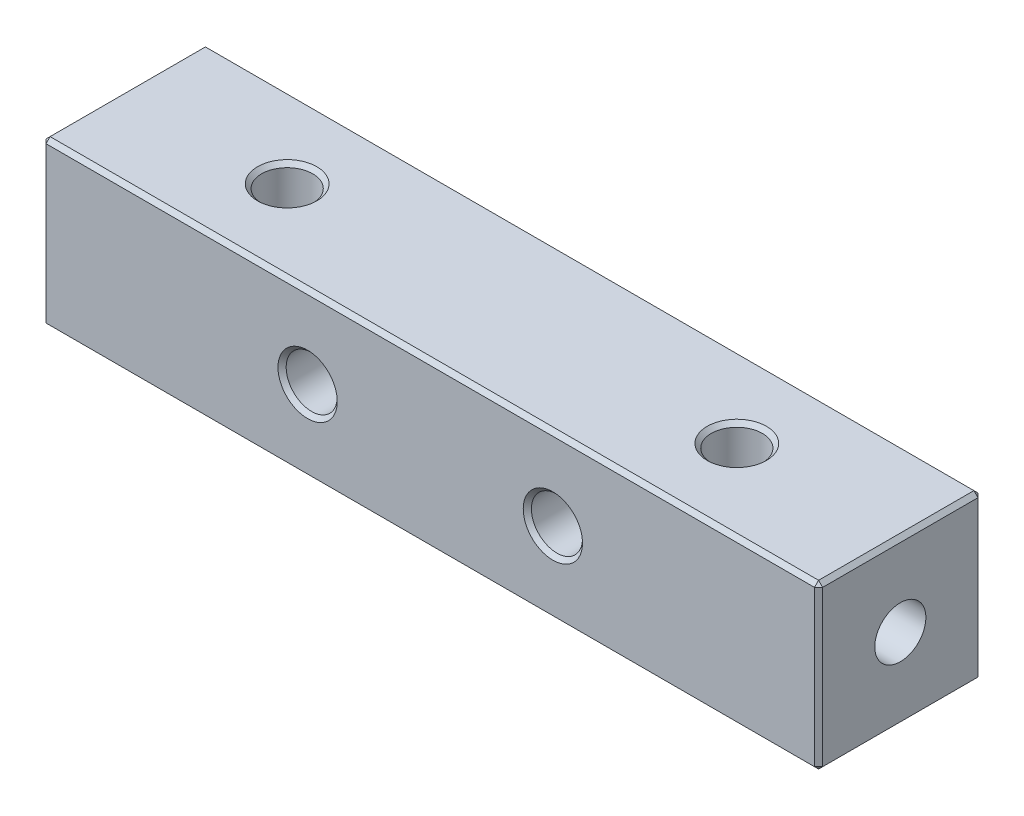
ISO-10303-21;
HEADER;
FILE_DESCRIPTION(('STEP AP214'),'2;1');
FILE_NAME('part.step','',(''),(''),'','','');
FILE_SCHEMA(('AUTOMOTIVE_DESIGN { 1 0 10303 214 1 1 1 1 }'));
ENDSEC;
DATA;
#1=APPLICATION_CONTEXT('core data for automotive mechanical design processes');
#2=APPLICATION_PROTOCOL_DEFINITION('international standard','automotive_design',2000,#1);
#3=PRODUCT_CONTEXT('',#1,'mechanical');
#4=PRODUCT('Part','Part','',(#3));
#5=PRODUCT_RELATED_PRODUCT_CATEGORY('part','',(#4));
#6=PRODUCT_DEFINITION_FORMATION('','',#4);
#7=PRODUCT_DEFINITION_CONTEXT('part definition',#1,'design');
#8=PRODUCT_DEFINITION('design','',#6,#7);
#9=PRODUCT_DEFINITION_SHAPE('','',#8);
#10=(LENGTH_UNIT() NAMED_UNIT(*) SI_UNIT(.MILLI.,.METRE.));
#11=(NAMED_UNIT(*) PLANE_ANGLE_UNIT() SI_UNIT($,.RADIAN.));
#12=(NAMED_UNIT(*) SI_UNIT($,.STERADIAN.) SOLID_ANGLE_UNIT());
#13=UNCERTAINTY_MEASURE_WITH_UNIT(LENGTH_MEASURE(1.E-05),#10,'distance_accuracy_value','');
#14=(GEOMETRIC_REPRESENTATION_CONTEXT(3) GLOBAL_UNCERTAINTY_ASSIGNED_CONTEXT((#13)) GLOBAL_UNIT_ASSIGNED_CONTEXT((#10,
#11,#12)) REPRESENTATION_CONTEXT('',''));
#15=CARTESIAN_POINT('',(0.,0.,0.));
#16=DIRECTION('',(0.,0.,1.));
#17=DIRECTION('',(1.,0.,0.));
#18=AXIS2_PLACEMENT_3D('',#15,#16,#17);
#19=CARTESIAN_POINT('',(19.,4.,-4.));
#20=DIRECTION('',(-1.,0.,0.));
#21=DIRECTION('',(0.,0.,1.));
#22=AXIS2_PLACEMENT_3D('',#19,#20,#21);
#23=PLANE('',#22);
#24=DIRECTION('',(0.,-1.,0.));
#25=VECTOR('',#24,1.);
#26=CARTESIAN_POINT('',(19.,4.,3.8));
#27=LINE('',#26,#25);
#28=CARTESIAN_POINT('',(19.,3.8,3.8));
#29=VERTEX_POINT('',#28);
#30=CARTESIAN_POINT('',(19.,-3.8,3.8));
#31=VERTEX_POINT('',#30);
#32=EDGE_CURVE('E222',#29,#31,#27,.T.);
#33=ORIENTED_EDGE('',*,*,#32,.T.);
#34=DIRECTION('',(0.,0.,-1.));
#35=VECTOR('',#34,1.);
#36=CARTESIAN_POINT('',(19.,-3.8,-4.));
#37=LINE('',#36,#35);
#38=CARTESIAN_POINT('',(19.,-3.8,-3.8));
#39=VERTEX_POINT('',#38);
#40=EDGE_CURVE('E224',#31,#39,#37,.T.);
#41=ORIENTED_EDGE('',*,*,#40,.T.);
#42=DIRECTION('',(0.,1.,0.));
#43=VECTOR('',#42,1.);
#44=CARTESIAN_POINT('',(19.,4.,-3.8));
#45=LINE('',#44,#43);
#46=CARTESIAN_POINT('',(19.,3.8,-3.8));
#47=VERTEX_POINT('',#46);
#48=EDGE_CURVE('E218',#39,#47,#45,.T.);
#49=ORIENTED_EDGE('',*,*,#48,.T.);
#50=DIRECTION('',(0.,0.,1.));
#51=VECTOR('',#50,1.);
#52=CARTESIAN_POINT('',(19.,3.8,4.));
#53=LINE('',#52,#51);
#54=EDGE_CURVE('E220',#47,#29,#53,.T.);
#55=ORIENTED_EDGE('',*,*,#54,.T.);
#56=EDGE_LOOP('',(#33,#41,#49,#55));
#57=FACE_BOUND('',#56,.T.);
#58=CARTESIAN_POINT('',(19.,0.,0.));
#59=DIRECTION('',(1.,0.,0.));
#60=DIRECTION('',(0.,0.,-1.));
#61=AXIS2_PLACEMENT_3D('',#58,#59,#60);
#62=CIRCLE('',#61,1.24999999999999);
#63=CARTESIAN_POINT('',(19.,0.,-1.24999999999999));
#64=VERTEX_POINT('',#63);
#65=EDGE_CURVE('E322',#64,#64,#62,.T.);
#66=ORIENTED_EDGE('',*,*,#65,.F.);
#67=EDGE_LOOP('',(#66));
#68=FACE_BOUND('',#67,.T.);
#69=ADVANCED_FACE('F39',(#57,#68),#23,.F.);
#70=CARTESIAN_POINT('',(-19.,4.,-4.));
#71=DIRECTION('',(1.,0.,0.));
#72=DIRECTION('',(0.,0.,-1.));
#73=AXIS2_PLACEMENT_3D('',#70,#71,#72);
#74=PLANE('',#73);
#75=DIRECTION('',(0.,-1.,0.));
#76=VECTOR('',#75,1.);
#77=CARTESIAN_POINT('',(-19.,4.,-3.8));
#78=LINE('',#77,#76);
#79=CARTESIAN_POINT('',(-19.,3.8,-3.8));
#80=VERTEX_POINT('',#79);
#81=CARTESIAN_POINT('',(-19.,-3.8,-3.8));
#82=VERTEX_POINT('',#81);
#83=EDGE_CURVE('E209',#80,#82,#78,.T.);
#84=ORIENTED_EDGE('',*,*,#83,.T.);
#85=DIRECTION('',(0.,0.,1.));
#86=VECTOR('',#85,1.);
#87=CARTESIAN_POINT('',(-19.,-3.8,-4.));
#88=LINE('',#87,#86);
#89=CARTESIAN_POINT('',(-19.,-3.8,3.8));
#90=VERTEX_POINT('',#89);
#91=EDGE_CURVE('E215',#82,#90,#88,.T.);
#92=ORIENTED_EDGE('',*,*,#91,.T.);
#93=DIRECTION('',(0.,1.,0.));
#94=VECTOR('',#93,1.);
#95=CARTESIAN_POINT('',(-19.,4.,3.8));
#96=LINE('',#95,#94);
#97=CARTESIAN_POINT('',(-19.,3.8,3.8));
#98=VERTEX_POINT('',#97);
#99=EDGE_CURVE('E213',#90,#98,#96,.T.);
#100=ORIENTED_EDGE('',*,*,#99,.T.);
#101=DIRECTION('',(0.,0.,-1.));
#102=VECTOR('',#101,1.);
#103=CARTESIAN_POINT('',(-19.,3.8,-4.));
#104=LINE('',#103,#102);
#105=EDGE_CURVE('E211',#98,#80,#104,.T.);
#106=ORIENTED_EDGE('',*,*,#105,.T.);
#107=EDGE_LOOP('',(#84,#92,#100,#106));
#108=FACE_BOUND('',#107,.T.);
#109=CARTESIAN_POINT('',(-19.,0.,0.));
#110=DIRECTION('',(-1.,0.,0.));
#111=DIRECTION('',(0.,0.,1.));
#112=AXIS2_PLACEMENT_3D('',#109,#110,#111);
#113=CIRCLE('',#112,1.25);
#114=CARTESIAN_POINT('',(-19.,0.,1.25));
#115=VERTEX_POINT('',#114);
#116=EDGE_CURVE('E246',#115,#115,#113,.T.);
#117=ORIENTED_EDGE('',*,*,#116,.F.);
#118=EDGE_LOOP('',(#117));
#119=FACE_BOUND('',#118,.T.);
#120=ADVANCED_FACE('F358',(#108,#119),#74,.F.);
#121=CARTESIAN_POINT('',(-19.,4.,-4.));
#122=DIRECTION('',(0.,0.,1.));
#123=DIRECTION('',(1.,0.,0.));
#124=AXIS2_PLACEMENT_3D('',#121,#122,#123);
#125=PLANE('',#124);
#126=DIRECTION('',(1.,0.,0.));
#127=VECTOR('',#126,1.);
#128=CARTESIAN_POINT('',(19.,3.8,-4.));
#129=LINE('',#128,#127);
#130=CARTESIAN_POINT('',(-18.8,3.8,-4.));
#131=VERTEX_POINT('',#130);
#132=CARTESIAN_POINT('',(18.8,3.8,-4.));
#133=VERTEX_POINT('',#132);
#134=EDGE_CURVE('E237',#131,#133,#129,.T.);
#135=ORIENTED_EDGE('',*,*,#134,.T.);
#136=DIRECTION('',(0.,-1.,0.));
#137=VECTOR('',#136,1.);
#138=CARTESIAN_POINT('',(18.8,4.,-4.));
#139=LINE('',#138,#137);
#140=CARTESIAN_POINT('',(18.8,-3.8,-4.));
#141=VERTEX_POINT('',#140);
#142=EDGE_CURVE('E239',#133,#141,#139,.T.);
#143=ORIENTED_EDGE('',*,*,#142,.T.);
#144=DIRECTION('',(-1.,0.,0.));
#145=VECTOR('',#144,1.);
#146=CARTESIAN_POINT('',(-19.,-3.8,-4.));
#147=LINE('',#146,#145);
#148=CARTESIAN_POINT('',(-18.8,-3.8,-4.));
#149=VERTEX_POINT('',#148);
#150=EDGE_CURVE('E233',#141,#149,#147,.T.);
#151=ORIENTED_EDGE('',*,*,#150,.T.);
#152=DIRECTION('',(0.,1.,0.));
#153=VECTOR('',#152,1.);
#154=CARTESIAN_POINT('',(-18.8,4.,-4.));
#155=LINE('',#154,#153);
#156=EDGE_CURVE('E235',#149,#131,#155,.T.);
#157=ORIENTED_EDGE('',*,*,#156,.T.);
#158=EDGE_LOOP('',(#135,#143,#151,#157));
#159=FACE_BOUND('',#158,.T.);
#160=CARTESIAN_POINT('',(-6.,0.,-4.));
#161=DIRECTION('',(0.,0.,1.));
#162=DIRECTION('',(1.,0.,0.));
#163=AXIS2_PLACEMENT_3D('',#160,#161,#162);
#164=CIRCLE('',#163,1.44999999999999);
#165=CARTESIAN_POINT('',(-4.55000000000001,0.,-4.));
#166=VERTEX_POINT('',#165);
#167=EDGE_CURVE('E230',#166,#166,#164,.T.);
#168=ORIENTED_EDGE('',*,*,#167,.T.);
#169=EDGE_LOOP('',(#168));
#170=FACE_BOUND('',#169,.T.);
#171=CARTESIAN_POINT('',(6.,0.,-4.));
#172=DIRECTION('',(0.,0.,1.));
#173=DIRECTION('',(1.,0.,0.));
#174=AXIS2_PLACEMENT_3D('',#171,#172,#173);
#175=CIRCLE('',#174,1.44999999999998);
#176=CARTESIAN_POINT('',(7.44999999999998,0.,-4.));
#177=VERTEX_POINT('',#176);
#178=EDGE_CURVE('E227',#177,#177,#175,.T.);
#179=ORIENTED_EDGE('',*,*,#178,.T.);
#180=EDGE_LOOP('',(#179));
#181=FACE_BOUND('',#180,.T.);
#182=ADVANCED_FACE('F364',(#159,#170,#181),#125,.F.);
#183=CARTESIAN_POINT('',(-19.,4.,4.));
#184=DIRECTION('',(0.,0.,-1.));
#185=DIRECTION('',(-1.,0.,0.));
#186=AXIS2_PLACEMENT_3D('',#183,#184,#185);
#187=PLANE('',#186);
#188=CARTESIAN_POINT('',(-6.,0.,4.));
#189=DIRECTION('',(0.,0.,-1.));
#190=DIRECTION('',(-1.,0.,0.));
#191=AXIS2_PLACEMENT_3D('',#188,#189,#190);
#192=CIRCLE('',#191,1.45);
#193=CARTESIAN_POINT('',(-7.45,0.,4.));
#194=VERTEX_POINT('',#193);
#195=EDGE_CURVE('E179',#194,#194,#192,.T.);
#196=ORIENTED_EDGE('',*,*,#195,.T.);
#197=EDGE_LOOP('',(#196));
#198=FACE_BOUND('',#197,.T.);
#199=CARTESIAN_POINT('',(6.,0.,4.));
#200=DIRECTION('',(0.,0.,-1.));
#201=DIRECTION('',(-1.,0.,0.));
#202=AXIS2_PLACEMENT_3D('',#199,#200,#201);
#203=CIRCLE('',#202,1.45);
#204=CARTESIAN_POINT('',(4.55,0.,4.));
#205=VERTEX_POINT('',#204);
#206=EDGE_CURVE('E176',#205,#205,#203,.T.);
#207=ORIENTED_EDGE('',*,*,#206,.T.);
#208=EDGE_LOOP('',(#207));
#209=FACE_BOUND('',#208,.T.);
#210=DIRECTION('',(-1.,0.,0.));
#211=VECTOR('',#210,1.);
#212=CARTESIAN_POINT('',(-19.,3.8,4.));
#213=LINE('',#212,#211);
#214=CARTESIAN_POINT('',(18.8,3.8,4.));
#215=VERTEX_POINT('',#214);
#216=CARTESIAN_POINT('',(-18.8,3.8,4.));
#217=VERTEX_POINT('',#216);
#218=EDGE_CURVE('E167',#215,#217,#213,.T.);
#219=ORIENTED_EDGE('',*,*,#218,.T.);
#220=DIRECTION('',(0.,-1.,0.));
#221=VECTOR('',#220,1.);
#222=CARTESIAN_POINT('',(-18.8,4.,4.));
#223=LINE('',#222,#221);
#224=CARTESIAN_POINT('',(-18.8,-3.8,4.));
#225=VERTEX_POINT('',#224);
#226=EDGE_CURVE('E173',#217,#225,#223,.T.);
#227=ORIENTED_EDGE('',*,*,#226,.T.);
#228=DIRECTION('',(1.,0.,0.));
#229=VECTOR('',#228,1.);
#230=CARTESIAN_POINT('',(-19.,-3.8,4.));
#231=LINE('',#230,#229);
#232=CARTESIAN_POINT('',(18.8,-3.8,4.));
#233=VERTEX_POINT('',#232);
#234=EDGE_CURVE('E171',#225,#233,#231,.T.);
#235=ORIENTED_EDGE('',*,*,#234,.T.);
#236=DIRECTION('',(0.,1.,0.));
#237=VECTOR('',#236,1.);
#238=CARTESIAN_POINT('',(18.8,4.,4.));
#239=LINE('',#238,#237);
#240=EDGE_CURVE('E169',#233,#215,#239,.T.);
#241=ORIENTED_EDGE('',*,*,#240,.T.);
#242=EDGE_LOOP('',(#219,#227,#235,#241));
#243=FACE_BOUND('',#242,.T.);
#244=ADVANCED_FACE('F524',(#198,#209,#243),#187,.F.);
#245=CARTESIAN_POINT('',(0.,4.,0.));
#246=DIRECTION('',(0.,1.,0.));
#247=DIRECTION('',(0.,0.,1.));
#248=AXIS2_PLACEMENT_3D('',#245,#246,#247);
#249=PLANE('',#248);
#250=CARTESIAN_POINT('',(11.,4.,0.));
#251=DIRECTION('',(0.,1.,0.));
#252=DIRECTION('',(0.,0.,1.));
#253=AXIS2_PLACEMENT_3D('',#250,#251,#252);
#254=CIRCLE('',#253,1.44999999999999);
#255=CARTESIAN_POINT('',(11.,4.,1.44999999999999));
#256=VERTEX_POINT('',#255);
#257=EDGE_CURVE('E206',#256,#256,#254,.F.);
#258=ORIENTED_EDGE('',*,*,#257,.T.);
#259=EDGE_LOOP('',(#258));
#260=FACE_BOUND('',#259,.T.);
#261=CARTESIAN_POINT('',(-11.,4.,0.));
#262=DIRECTION('',(0.,1.,0.));
#263=DIRECTION('',(0.,0.,1.));
#264=AXIS2_PLACEMENT_3D('',#261,#262,#263);
#265=CIRCLE('',#264,1.44999999999998);
#266=CARTESIAN_POINT('',(-11.,4.,1.44999999999998));
#267=VERTEX_POINT('',#266);
#268=EDGE_CURVE('E203',#267,#267,#265,.F.);
#269=ORIENTED_EDGE('',*,*,#268,.T.);
#270=EDGE_LOOP('',(#269));
#271=FACE_BOUND('',#270,.T.);
#272=DIRECTION('',(0.,0.,1.));
#273=VECTOR('',#272,1.);
#274=CARTESIAN_POINT('',(-18.8,4.,4.));
#275=LINE('',#274,#273);
#276=CARTESIAN_POINT('',(-18.8,4.,-3.8));
#277=VERTEX_POINT('',#276);
#278=CARTESIAN_POINT('',(-18.8,4.,3.8));
#279=VERTEX_POINT('',#278);
#280=EDGE_CURVE('E198',#277,#279,#275,.T.);
#281=ORIENTED_EDGE('',*,*,#280,.T.);
#282=DIRECTION('',(1.,0.,0.));
#283=VECTOR('',#282,1.);
#284=CARTESIAN_POINT('',(19.,4.,3.8));
#285=LINE('',#284,#283);
#286=CARTESIAN_POINT('',(18.8,4.,3.8));
#287=VERTEX_POINT('',#286);
#288=EDGE_CURVE('E200',#279,#287,#285,.T.);
#289=ORIENTED_EDGE('',*,*,#288,.T.);
#290=DIRECTION('',(0.,0.,-1.));
#291=VECTOR('',#290,1.);
#292=CARTESIAN_POINT('',(18.8,4.,-4.));
#293=LINE('',#292,#291);
#294=CARTESIAN_POINT('',(18.8,4.,-3.8));
#295=VERTEX_POINT('',#294);
#296=EDGE_CURVE('E196',#287,#295,#293,.T.);
#297=ORIENTED_EDGE('',*,*,#296,.T.);
#298=DIRECTION('',(-1.,0.,0.));
#299=VECTOR('',#298,1.);
#300=CARTESIAN_POINT('',(-19.,4.,-3.8));
#301=LINE('',#300,#299);
#302=EDGE_CURVE('E194',#295,#277,#301,.T.);
#303=ORIENTED_EDGE('',*,*,#302,.T.);
#304=EDGE_LOOP('',(#281,#289,#297,#303));
#305=FACE_BOUND('',#304,.T.);
#306=ADVANCED_FACE('F521',(#260,#271,#305),#249,.T.);
#307=CARTESIAN_POINT('',(0.,-4.,0.));
#308=DIRECTION('',(0.,1.,0.));
#309=DIRECTION('',(0.,0.,1.));
#310=AXIS2_PLACEMENT_3D('',#307,#308,#309);
#311=PLANE('',#310);
#312=CARTESIAN_POINT('',(11.,-4.,0.));
#313=DIRECTION('',(0.,1.,0.));
#314=DIRECTION('',(0.,0.,1.));
#315=AXIS2_PLACEMENT_3D('',#312,#313,#314);
#316=CIRCLE('',#315,1.45000000000001);
#317=CARTESIAN_POINT('',(11.,-4.,1.45000000000001));
#318=VERTEX_POINT('',#317);
#319=EDGE_CURVE('E153',#318,#318,#316,.T.);
#320=ORIENTED_EDGE('',*,*,#319,.T.);
#321=EDGE_LOOP('',(#320));
#322=FACE_BOUND('',#321,.T.);
#323=CARTESIAN_POINT('',(-11.,-4.,0.));
#324=DIRECTION('',(0.,1.,0.));
#325=DIRECTION('',(0.,0.,1.));
#326=AXIS2_PLACEMENT_3D('',#323,#324,#325);
#327=CIRCLE('',#326,1.45000000000001);
#328=CARTESIAN_POINT('',(-11.,-4.,1.45000000000001));
#329=VERTEX_POINT('',#328);
#330=EDGE_CURVE('E158',#329,#329,#327,.T.);
#331=ORIENTED_EDGE('',*,*,#330,.T.);
#332=EDGE_LOOP('',(#331));
#333=FACE_BOUND('',#332,.T.);
#334=DIRECTION('',(0.,0.,1.));
#335=VECTOR('',#334,1.);
#336=CARTESIAN_POINT('',(18.8,-4.,0.));
#337=LINE('',#336,#335);
#338=CARTESIAN_POINT('',(18.8,-4.,-3.8));
#339=VERTEX_POINT('',#338);
#340=CARTESIAN_POINT('',(18.8,-4.,3.8));
#341=VERTEX_POINT('',#340);
#342=EDGE_CURVE('E328',#339,#341,#337,.T.);
#343=ORIENTED_EDGE('',*,*,#342,.T.);
#344=DIRECTION('',(-1.,0.,0.));
#345=VECTOR('',#344,1.);
#346=CARTESIAN_POINT('',(0.,-4.,3.8));
#347=LINE('',#346,#345);
#348=CARTESIAN_POINT('',(-18.8,-4.,3.8));
#349=VERTEX_POINT('',#348);
#350=EDGE_CURVE('E333',#341,#349,#347,.T.);
#351=ORIENTED_EDGE('',*,*,#350,.T.);
#352=DIRECTION('',(0.,0.,-1.));
#353=VECTOR('',#352,1.);
#354=CARTESIAN_POINT('',(-18.8,-4.,0.));
#355=LINE('',#354,#353);
#356=CARTESIAN_POINT('',(-18.8,-4.,-3.8));
#357=VERTEX_POINT('',#356);
#358=EDGE_CURVE('E330',#349,#357,#355,.T.);
#359=ORIENTED_EDGE('',*,*,#358,.T.);
#360=DIRECTION('',(1.,0.,0.));
#361=VECTOR('',#360,1.);
#362=CARTESIAN_POINT('',(0.,-4.,-3.8));
#363=LINE('',#362,#361);
#364=EDGE_CURVE('E311',#357,#339,#363,.T.);
#365=ORIENTED_EDGE('',*,*,#364,.T.);
#366=EDGE_LOOP('',(#343,#351,#359,#365));
#367=FACE_BOUND('',#366,.T.);
#368=ADVANCED_FACE('F143',(#322,#333,#367),#311,.F.);
#369=CARTESIAN_POINT('',(11.,4.,0.));
#370=DIRECTION('',(0.,1.,0.));
#371=DIRECTION('',(0.,0.,1.));
#372=AXIS2_PLACEMENT_3D('',#369,#370,#371);
#373=CYLINDRICAL_SURFACE('',#372,1.24999999999999);
#374=CARTESIAN_POINT('',(11.,0.,0.));
#375=DIRECTION('',(-0.707106781186547,0.707106781186547,0.));
#376=DIRECTION('',(0.707106781186547,0.707106781186547,0.));
#377=AXIS2_PLACEMENT_3D('',#374,#375,#376);
#378=ELLIPSE('',#377,1.76776695296636,1.24999999999999);
#379=CARTESIAN_POINT('',(11.,0.,-1.25));
#380=VERTEX_POINT('',#379);
#381=CARTESIAN_POINT('',(11.,0.,1.24999999999999));
#382=VERTEX_POINT('',#381);
#383=EDGE_CURVE('E48',#380,#382,#378,.F.);
#384=ORIENTED_EDGE('',*,*,#383,.T.);
#385=CARTESIAN_POINT('',(11.,0.,0.));
#386=DIRECTION('',(0.707106781186547,0.707106781186547,0.));
#387=DIRECTION('',(-0.707106781186547,0.707106781186547,0.));
#388=AXIS2_PLACEMENT_3D('',#385,#386,#387);
#389=ELLIPSE('',#388,1.76776695296636,1.24999999999999);
#390=EDGE_CURVE('E11',#382,#380,#389,.T.);
#391=ORIENTED_EDGE('',*,*,#390,.T.);
#392=EDGE_LOOP('',(#384,#391));
#393=FACE_BOUND('',#392,.T.);
#394=CARTESIAN_POINT('',(11.,-3.79999999999999,0.));
#395=DIRECTION('',(0.,1.,0.));
#396=DIRECTION('',(0.,0.,1.));
#397=AXIS2_PLACEMENT_3D('',#394,#395,#396);
#398=CIRCLE('',#397,1.24999999999999);
#399=CARTESIAN_POINT('',(11.,-3.79999999999999,1.24999999999999));
#400=VERTEX_POINT('',#399);
#401=EDGE_CURVE('E148',#400,#400,#398,.F.);
#402=ORIENTED_EDGE('',*,*,#401,.T.);
#403=EDGE_LOOP('',(#402));
#404=FACE_BOUND('',#403,.T.);
#405=CARTESIAN_POINT('',(11.,3.8,0.));
#406=DIRECTION('',(0.,1.,0.));
#407=DIRECTION('',(0.,0.,1.));
#408=AXIS2_PLACEMENT_3D('',#405,#406,#407);
#409=CIRCLE('',#408,1.24999999999999);
#410=CARTESIAN_POINT('',(11.,3.8,1.24999999999999));
#411=VERTEX_POINT('',#410);
#412=EDGE_CURVE('E151',#411,#411,#409,.T.);
#413=ORIENTED_EDGE('',*,*,#412,.T.);
#414=EDGE_LOOP('',(#413));
#415=FACE_BOUND('',#414,.T.);
#416=ADVANCED_FACE('F139',(#393,#404,#415),#373,.F.);
#417=CARTESIAN_POINT('',(-11.,4.,0.));
#418=DIRECTION('',(0.,1.,0.));
#419=DIRECTION('',(0.,0.,1.));
#420=AXIS2_PLACEMENT_3D('',#417,#418,#419);
#421=CYLINDRICAL_SURFACE('',#420,1.24999999999999);
#422=CARTESIAN_POINT('',(-11.,0.,0.));
#423=DIRECTION('',(0.707106781186547,0.707106781186547,0.));
#424=DIRECTION('',(-0.707106781186547,0.707106781186547,0.));
#425=AXIS2_PLACEMENT_3D('',#422,#423,#424);
#426=ELLIPSE('',#425,1.76776695296636,1.25);
#427=CARTESIAN_POINT('',(-11.,0.,1.25));
#428=VERTEX_POINT('',#427);
#429=CARTESIAN_POINT('',(-11.,0.,-1.24999999999999));
#430=VERTEX_POINT('',#429);
#431=EDGE_CURVE('E242',#428,#430,#426,.F.);
#432=ORIENTED_EDGE('',*,*,#431,.T.);
#433=CARTESIAN_POINT('',(-11.,0.,0.));
#434=DIRECTION('',(-0.707106781186547,0.707106781186547,0.));
#435=DIRECTION('',(0.707106781186547,0.707106781186547,0.));
#436=AXIS2_PLACEMENT_3D('',#433,#434,#435);
#437=ELLIPSE('',#436,1.76776695296636,1.25);
#438=EDGE_CURVE('E59',#430,#428,#437,.T.);
#439=ORIENTED_EDGE('',*,*,#438,.T.);
#440=EDGE_LOOP('',(#432,#439));
#441=FACE_BOUND('',#440,.T.);
#442=CARTESIAN_POINT('',(-11.,-3.79999999999999,0.));
#443=DIRECTION('',(0.,1.,0.));
#444=DIRECTION('',(0.,0.,1.));
#445=AXIS2_PLACEMENT_3D('',#442,#443,#444);
#446=CIRCLE('',#445,1.24999999999999);
#447=CARTESIAN_POINT('',(-11.,-3.79999999999999,1.24999999999999));
#448=VERTEX_POINT('',#447);
#449=EDGE_CURVE('E164',#448,#448,#446,.F.);
#450=ORIENTED_EDGE('',*,*,#449,.T.);
#451=EDGE_LOOP('',(#450));
#452=FACE_BOUND('',#451,.T.);
#453=CARTESIAN_POINT('',(-11.,3.80000000000001,0.));
#454=DIRECTION('',(0.,1.,0.));
#455=DIRECTION('',(0.,0.,1.));
#456=AXIS2_PLACEMENT_3D('',#453,#454,#455);
#457=CIRCLE('',#456,1.24999999999999);
#458=CARTESIAN_POINT('',(-11.,3.80000000000001,1.24999999999999));
#459=VERTEX_POINT('',#458);
#460=EDGE_CURVE('E155',#459,#459,#457,.T.);
#461=ORIENTED_EDGE('',*,*,#460,.T.);
#462=EDGE_LOOP('',(#461));
#463=FACE_BOUND('',#462,.T.);
#464=ADVANCED_FACE('F142',(#441,#452,#463),#421,.F.);
#465=CARTESIAN_POINT('',(-6.,0.,-4.));
#466=DIRECTION('',(0.,0.,-1.));
#467=DIRECTION('',(-1.,0.,0.));
#468=AXIS2_PLACEMENT_3D('',#465,#466,#467);
#469=CYLINDRICAL_SURFACE('',#468,1.24999999999999);
#470=CARTESIAN_POINT('',(-6.,0.,3.79999999999999));
#471=DIRECTION('',(0.,0.,-1.));
#472=DIRECTION('',(-1.,0.,0.));
#473=AXIS2_PLACEMENT_3D('',#470,#471,#472);
#474=CIRCLE('',#473,1.24999999999999);
#475=CARTESIAN_POINT('',(-7.24999999999999,0.,3.79999999999999));
#476=VERTEX_POINT('',#475);
#477=EDGE_CURVE('E185',#476,#476,#474,.F.);
#478=ORIENTED_EDGE('',*,*,#477,.T.);
#479=EDGE_LOOP('',(#478));
#480=FACE_BOUND('',#479,.T.);
#481=CARTESIAN_POINT('',(-6.,0.,-3.8));
#482=DIRECTION('',(0.,0.,1.));
#483=DIRECTION('',(1.,0.,0.));
#484=AXIS2_PLACEMENT_3D('',#481,#482,#483);
#485=CIRCLE('',#484,1.24999999999999);
#486=CARTESIAN_POINT('',(-4.75,0.,-3.8));
#487=VERTEX_POINT('',#486);
#488=EDGE_CURVE('E182',#487,#487,#485,.F.);
#489=ORIENTED_EDGE('',*,*,#488,.T.);
#490=EDGE_LOOP('',(#489));
#491=FACE_BOUND('',#490,.T.);
#492=ADVANCED_FACE('F509',(#480,#491),#469,.F.);
#493=CARTESIAN_POINT('',(6.,0.,-4.));
#494=DIRECTION('',(0.,0.,-1.));
#495=DIRECTION('',(-1.,0.,0.));
#496=AXIS2_PLACEMENT_3D('',#493,#494,#495);
#497=CYLINDRICAL_SURFACE('',#496,1.24999999999999);
#498=CARTESIAN_POINT('',(6.,0.,3.79999999999999));
#499=DIRECTION('',(0.,0.,-1.));
#500=DIRECTION('',(-1.,0.,0.));
#501=AXIS2_PLACEMENT_3D('',#498,#499,#500);
#502=CIRCLE('',#501,1.24999999999999);
#503=CARTESIAN_POINT('',(4.75000000000001,0.,3.79999999999999));
#504=VERTEX_POINT('',#503);
#505=EDGE_CURVE('E191',#504,#504,#502,.F.);
#506=ORIENTED_EDGE('',*,*,#505,.T.);
#507=EDGE_LOOP('',(#506));
#508=FACE_BOUND('',#507,.T.);
#509=CARTESIAN_POINT('',(6.,0.,-3.80000000000001));
#510=DIRECTION('',(0.,0.,1.));
#511=DIRECTION('',(1.,0.,0.));
#512=AXIS2_PLACEMENT_3D('',#509,#510,#511);
#513=CIRCLE('',#512,1.24999999999999);
#514=CARTESIAN_POINT('',(7.25,0.,-3.80000000000001));
#515=VERTEX_POINT('',#514);
#516=EDGE_CURVE('E188',#515,#515,#513,.F.);
#517=ORIENTED_EDGE('',*,*,#516,.T.);
#518=EDGE_LOOP('',(#517));
#519=FACE_BOUND('',#518,.T.);
#520=ADVANCED_FACE('F352',(#508,#519),#497,.F.);
#521=CARTESIAN_POINT('',(11.,-4.,0.));
#522=DIRECTION('',(0.,-1.,0.));
#523=DIRECTION('',(0.,0.,-1.));
#524=AXIS2_PLACEMENT_3D('',#521,#522,#523);
#525=CONICAL_SURFACE('',#524,1.45000000000001,0.785398163397457);
#526=ORIENTED_EDGE('',*,*,#401,.F.);
#527=EDGE_LOOP('',(#526));
#528=FACE_BOUND('',#527,.T.);
#529=ORIENTED_EDGE('',*,*,#319,.F.);
#530=EDGE_LOOP('',(#529));
#531=FACE_BOUND('',#530,.T.);
#532=ADVANCED_FACE('F342',(#528,#531),#525,.F.);
#533=CARTESIAN_POINT('',(-11.,-4.,0.));
#534=DIRECTION('',(0.,-1.,0.));
#535=DIRECTION('',(0.,0.,-1.));
#536=AXIS2_PLACEMENT_3D('',#533,#534,#535);
#537=CONICAL_SURFACE('',#536,1.45000000000001,0.785398163397457);
#538=ORIENTED_EDGE('',*,*,#449,.F.);
#539=EDGE_LOOP('',(#538));
#540=FACE_BOUND('',#539,.T.);
#541=ORIENTED_EDGE('',*,*,#330,.F.);
#542=EDGE_LOOP('',(#541));
#543=FACE_BOUND('',#542,.T.);
#544=ADVANCED_FACE('F339',(#540,#543),#537,.F.);
#545=CARTESIAN_POINT('',(-6.,0.,4.));
#546=DIRECTION('',(0.,0.,1.));
#547=DIRECTION('',(1.,0.,0.));
#548=AXIS2_PLACEMENT_3D('',#545,#546,#547);
#549=CONICAL_SURFACE('',#548,1.45,0.785398163397457);
#550=ORIENTED_EDGE('',*,*,#477,.F.);
#551=EDGE_LOOP('',(#550));
#552=FACE_BOUND('',#551,.T.);
#553=ORIENTED_EDGE('',*,*,#195,.F.);
#554=EDGE_LOOP('',(#553));
#555=FACE_BOUND('',#554,.T.);
#556=ADVANCED_FACE('F341',(#552,#555),#549,.F.);
#557=CARTESIAN_POINT('',(6.,0.,4.));
#558=DIRECTION('',(0.,0.,1.));
#559=DIRECTION('',(1.,0.,0.));
#560=AXIS2_PLACEMENT_3D('',#557,#558,#559);
#561=CONICAL_SURFACE('',#560,1.45,0.785398163397457);
#562=ORIENTED_EDGE('',*,*,#505,.F.);
#563=EDGE_LOOP('',(#562));
#564=FACE_BOUND('',#563,.T.);
#565=ORIENTED_EDGE('',*,*,#206,.F.);
#566=EDGE_LOOP('',(#565));
#567=FACE_BOUND('',#566,.T.);
#568=ADVANCED_FACE('F349',(#564,#567),#561,.F.);
#569=CARTESIAN_POINT('',(11.,3.8,0.));
#570=DIRECTION('',(0.,1.,0.));
#571=DIRECTION('',(0.,0.,1.));
#572=AXIS2_PLACEMENT_3D('',#569,#570,#571);
#573=CONICAL_SURFACE('',#572,1.24999999999999,0.785398163397448);
#574=ORIENTED_EDGE('',*,*,#257,.F.);
#575=EDGE_LOOP('',(#574));
#576=FACE_BOUND('',#575,.T.);
#577=ORIENTED_EDGE('',*,*,#412,.F.);
#578=EDGE_LOOP('',(#577));
#579=FACE_BOUND('',#578,.T.);
#580=ADVANCED_FACE('F386',(#576,#579),#573,.F.);
#581=CARTESIAN_POINT('',(-11.,3.80000000000001,0.));
#582=DIRECTION('',(0.,1.,0.));
#583=DIRECTION('',(0.,0.,1.));
#584=AXIS2_PLACEMENT_3D('',#581,#582,#583);
#585=CONICAL_SURFACE('',#584,1.24999999999999,0.785398163397448);
#586=ORIENTED_EDGE('',*,*,#268,.F.);
#587=EDGE_LOOP('',(#586));
#588=FACE_BOUND('',#587,.T.);
#589=ORIENTED_EDGE('',*,*,#460,.F.);
#590=EDGE_LOOP('',(#589));
#591=FACE_BOUND('',#590,.T.);
#592=ADVANCED_FACE('F391',(#588,#591),#585,.F.);
#593=CARTESIAN_POINT('',(18.8,4.,0.));
#594=DIRECTION('',(0.707106781186548,0.707106781186548,0.));
#595=DIRECTION('',(0.,0.,1.));
#596=AXIS2_PLACEMENT_3D('',#593,#594,#595);
#597=PLANE('',#596);
#598=DIRECTION('',(0.707106781186547,-0.707106781186547,0.));
#599=VECTOR('',#598,1.);
#600=CARTESIAN_POINT('',(18.8,4.,-3.8));
#601=LINE('',#600,#599);
#602=EDGE_CURVE('E308',#295,#47,#601,.T.);
#603=ORIENTED_EDGE('',*,*,#602,.F.);
#604=ORIENTED_EDGE('',*,*,#296,.F.);
#605=DIRECTION('',(-0.707106781186547,0.707106781186547,0.));
#606=VECTOR('',#605,1.);
#607=CARTESIAN_POINT('',(18.9,3.9,3.8));
#608=LINE('',#607,#606);
#609=EDGE_CURVE('E305',#29,#287,#608,.T.);
#610=ORIENTED_EDGE('',*,*,#609,.F.);
#611=ORIENTED_EDGE('',*,*,#54,.F.);
#612=EDGE_LOOP('',(#603,#604,#610,#611));
#613=FACE_BOUND('',#612,.T.);
#614=ADVANCED_FACE('F397',(#613),#597,.T.);
#615=CARTESIAN_POINT('',(18.8,4.,-3.8));
#616=DIRECTION('',(0.577350269189626,0.577350269189626,-0.577350269189626));
#617=DIRECTION('',(-0.707106781186548,0.,-0.707106781186548));
#618=AXIS2_PLACEMENT_3D('',#615,#616,#617);
#619=PLANE('',#618);
#620=DIRECTION('',(0.,0.707106781186547,0.707106781186547));
#621=VECTOR('',#620,1.);
#622=CARTESIAN_POINT('',(18.8,4.,-3.8));
#623=LINE('',#622,#621);
#624=EDGE_CURVE('E299',#295,#133,#623,.F.);
#625=ORIENTED_EDGE('',*,*,#624,.F.);
#626=ORIENTED_EDGE('',*,*,#602,.T.);
#627=DIRECTION('',(0.707106781186547,0.,0.707106781186547));
#628=VECTOR('',#627,1.);
#629=CARTESIAN_POINT('',(18.9,3.8,-3.9));
#630=LINE('',#629,#628);
#631=EDGE_CURVE('E302',#133,#47,#630,.T.);
#632=ORIENTED_EDGE('',*,*,#631,.F.);
#633=EDGE_LOOP('',(#625,#626,#632));
#634=FACE_BOUND('',#633,.T.);
#635=ADVANCED_FACE('F402',(#634),#619,.T.);
#636=CARTESIAN_POINT('',(18.8,3.8,4.));
#637=DIRECTION('',(0.577350269189626,0.577350269189626,0.577350269189626));
#638=DIRECTION('',(0.707106781186548,0.,-0.707106781186548));
#639=AXIS2_PLACEMENT_3D('',#636,#637,#638);
#640=PLANE('',#639);
#641=DIRECTION('',(-0.707106781186547,0.,0.707106781186547));
#642=VECTOR('',#641,1.);
#643=CARTESIAN_POINT('',(18.8,3.8,4.));
#644=LINE('',#643,#642);
#645=EDGE_CURVE('E294',#29,#215,#644,.T.);
#646=ORIENTED_EDGE('',*,*,#645,.F.);
#647=ORIENTED_EDGE('',*,*,#609,.T.);
#648=DIRECTION('',(0.,-0.707106781186547,0.707106781186547));
#649=VECTOR('',#648,1.);
#650=CARTESIAN_POINT('',(18.8,3.8,4.));
#651=LINE('',#650,#649);
#652=EDGE_CURVE('E297',#215,#287,#651,.F.);
#653=ORIENTED_EDGE('',*,*,#652,.F.);
#654=EDGE_LOOP('',(#646,#647,#653));
#655=FACE_BOUND('',#654,.T.);
#656=ADVANCED_FACE('F407',(#655),#640,.T.);
#657=CARTESIAN_POINT('',(18.8,4.,-4.));
#658=DIRECTION('',(-0.707106781186548,0.,0.707106781186548));
#659=DIRECTION('',(0.,-1.,0.));
#660=AXIS2_PLACEMENT_3D('',#657,#658,#659);
#661=PLANE('',#660);
#662=ORIENTED_EDGE('',*,*,#631,.T.);
#663=ORIENTED_EDGE('',*,*,#48,.F.);
#664=DIRECTION('',(-0.707106781186547,0.,-0.707106781186547));
#665=VECTOR('',#664,1.);
#666=CARTESIAN_POINT('',(19.,-3.8,-3.8));
#667=LINE('',#666,#665);
#668=EDGE_CURVE('E289',#141,#39,#667,.F.);
#669=ORIENTED_EDGE('',*,*,#668,.F.);
#670=ORIENTED_EDGE('',*,*,#142,.F.);
#671=EDGE_LOOP('',(#662,#663,#669,#670));
#672=FACE_BOUND('',#671,.T.);
#673=ADVANCED_FACE('F412',(#672),#661,.F.);
#674=CARTESIAN_POINT('',(0.,4.,-3.8));
#675=DIRECTION('',(0.,0.707106781186548,-0.707106781186548));
#676=DIRECTION('',(1.,0.,0.));
#677=AXIS2_PLACEMENT_3D('',#674,#675,#676);
#678=PLANE('',#677);
#679=ORIENTED_EDGE('',*,*,#624,.T.);
#680=ORIENTED_EDGE('',*,*,#134,.F.);
#681=DIRECTION('',(0.,-0.707106781186547,-0.707106781186547));
#682=VECTOR('',#681,1.);
#683=CARTESIAN_POINT('',(-18.8,3.9,-3.9));
#684=LINE('',#683,#682);
#685=EDGE_CURVE('E286',#277,#131,#684,.T.);
#686=ORIENTED_EDGE('',*,*,#685,.F.);
#687=ORIENTED_EDGE('',*,*,#302,.F.);
#688=EDGE_LOOP('',(#679,#680,#686,#687));
#689=FACE_BOUND('',#688,.T.);
#690=ADVANCED_FACE('F417',(#689),#678,.T.);
#691=CARTESIAN_POINT('',(-18.8,4.,0.));
#692=DIRECTION('',(-0.707106781186548,0.707106781186548,0.));
#693=DIRECTION('',(0.,0.,-1.));
#694=AXIS2_PLACEMENT_3D('',#691,#692,#693);
#695=PLANE('',#694);
#696=DIRECTION('',(-0.707106781186547,-0.707106781186547,0.));
#697=VECTOR('',#696,1.);
#698=CARTESIAN_POINT('',(-19.,3.8,3.8));
#699=LINE('',#698,#697);
#700=EDGE_CURVE('E280',#279,#98,#699,.T.);
#701=ORIENTED_EDGE('',*,*,#700,.F.);
#702=ORIENTED_EDGE('',*,*,#280,.F.);
#703=DIRECTION('',(0.707106781186547,0.707106781186547,0.));
#704=VECTOR('',#703,1.);
#705=CARTESIAN_POINT('',(-19.,3.8,-3.8));
#706=LINE('',#705,#704);
#707=EDGE_CURVE('E283',#80,#277,#706,.T.);
#708=ORIENTED_EDGE('',*,*,#707,.F.);
#709=ORIENTED_EDGE('',*,*,#105,.F.);
#710=EDGE_LOOP('',(#701,#702,#708,#709));
#711=FACE_BOUND('',#710,.T.);
#712=ADVANCED_FACE('F422',(#711),#695,.T.);
#713=CARTESIAN_POINT('',(0.,4.,3.8));
#714=DIRECTION('',(0.,0.707106781186548,0.707106781186548));
#715=DIRECTION('',(-1.,0.,0.));
#716=AXIS2_PLACEMENT_3D('',#713,#714,#715);
#717=PLANE('',#716);
#718=ORIENTED_EDGE('',*,*,#652,.T.);
#719=ORIENTED_EDGE('',*,*,#288,.F.);
#720=DIRECTION('',(0.,0.707106781186547,-0.707106781186547));
#721=VECTOR('',#720,1.);
#722=CARTESIAN_POINT('',(-18.8,3.9,3.9));
#723=LINE('',#722,#721);
#724=EDGE_CURVE('E277',#217,#279,#723,.T.);
#725=ORIENTED_EDGE('',*,*,#724,.F.);
#726=ORIENTED_EDGE('',*,*,#218,.F.);
#727=EDGE_LOOP('',(#718,#719,#725,#726));
#728=FACE_BOUND('',#727,.T.);
#729=ADVANCED_FACE('F427',(#728),#717,.T.);
#730=CARTESIAN_POINT('',(19.,4.,3.8));
#731=DIRECTION('',(-0.707106781186548,0.,-0.707106781186548));
#732=DIRECTION('',(0.,-1.,0.));
#733=AXIS2_PLACEMENT_3D('',#730,#731,#732);
#734=PLANE('',#733);
#735=ORIENTED_EDGE('',*,*,#645,.T.);
#736=ORIENTED_EDGE('',*,*,#240,.F.);
#737=DIRECTION('',(0.707106781186547,0.,-0.707106781186547));
#738=VECTOR('',#737,1.);
#739=CARTESIAN_POINT('',(18.9,-3.8,3.9));
#740=LINE('',#739,#738);
#741=EDGE_CURVE('E274',#31,#233,#740,.F.);
#742=ORIENTED_EDGE('',*,*,#741,.F.);
#743=ORIENTED_EDGE('',*,*,#32,.F.);
#744=EDGE_LOOP('',(#735,#736,#742,#743));
#745=FACE_BOUND('',#744,.T.);
#746=ADVANCED_FACE('F432',(#745),#734,.F.);
#747=CARTESIAN_POINT('',(19.,-3.8,-4.));
#748=DIRECTION('',(-0.707106781186548,0.707106781186548,0.));
#749=DIRECTION('',(0.,0.,-1.));
#750=AXIS2_PLACEMENT_3D('',#747,#748,#749);
#751=PLANE('',#750);
#752=DIRECTION('',(0.707106781186547,0.707106781186547,0.));
#753=VECTOR('',#752,1.);
#754=CARTESIAN_POINT('',(19.,-3.8,-3.8));
#755=LINE('',#754,#753);
#756=EDGE_CURVE('E291',#39,#339,#755,.F.);
#757=ORIENTED_EDGE('',*,*,#756,.F.);
#758=ORIENTED_EDGE('',*,*,#40,.F.);
#759=DIRECTION('',(-0.707106781186547,-0.707106781186547,0.));
#760=VECTOR('',#759,1.);
#761=CARTESIAN_POINT('',(18.8,-4.,3.8));
#762=LINE('',#761,#760);
#763=EDGE_CURVE('E271',#341,#31,#762,.F.);
#764=ORIENTED_EDGE('',*,*,#763,.F.);
#765=ORIENTED_EDGE('',*,*,#342,.F.);
#766=EDGE_LOOP('',(#757,#758,#764,#765));
#767=FACE_BOUND('',#766,.T.);
#768=ADVANCED_FACE('F437',(#767),#751,.F.);
#769=CARTESIAN_POINT('',(19.,-3.8,-3.8));
#770=DIRECTION('',(0.577350269189626,-0.577350269189626,-0.577350269189626));
#771=DIRECTION('',(-0.707106781186548,0.,-0.707106781186548));
#772=AXIS2_PLACEMENT_3D('',#769,#770,#771);
#773=PLANE('',#772);
#774=ORIENTED_EDGE('',*,*,#668,.T.);
#775=ORIENTED_EDGE('',*,*,#756,.T.);
#776=DIRECTION('',(0.,-0.707106781186547,0.707106781186547));
#777=VECTOR('',#776,1.);
#778=CARTESIAN_POINT('',(18.8,-3.9,-3.9));
#779=LINE('',#778,#777);
#780=EDGE_CURVE('E268',#141,#339,#779,.T.);
#781=ORIENTED_EDGE('',*,*,#780,.F.);
#782=EDGE_LOOP('',(#774,#775,#781));
#783=FACE_BOUND('',#782,.T.);
#784=ADVANCED_FACE('F442',(#783),#773,.T.);
#785=CARTESIAN_POINT('',(-19.,3.8,-3.8));
#786=DIRECTION('',(-0.577350269189626,0.577350269189626,-0.577350269189626));
#787=DIRECTION('',(-0.707106781186548,0.,0.707106781186548));
#788=AXIS2_PLACEMENT_3D('',#785,#786,#787);
#789=PLANE('',#788);
#790=ORIENTED_EDGE('',*,*,#707,.T.);
#791=ORIENTED_EDGE('',*,*,#685,.T.);
#792=DIRECTION('',(0.707106781186547,0.,-0.707106781186547));
#793=VECTOR('',#792,1.);
#794=CARTESIAN_POINT('',(-19.,3.8,-3.8));
#795=LINE('',#794,#793);
#796=EDGE_CURVE('E265',#80,#131,#795,.T.);
#797=ORIENTED_EDGE('',*,*,#796,.F.);
#798=EDGE_LOOP('',(#790,#791,#797));
#799=FACE_BOUND('',#798,.T.);
#800=ADVANCED_FACE('F447',(#799),#789,.T.);
#801=CARTESIAN_POINT('',(-19.,3.8,3.8));
#802=DIRECTION('',(-0.577350269189626,0.577350269189626,0.577350269189626));
#803=DIRECTION('',(0.707106781186548,0.,0.707106781186548));
#804=AXIS2_PLACEMENT_3D('',#801,#802,#803);
#805=PLANE('',#804);
#806=ORIENTED_EDGE('',*,*,#724,.T.);
#807=ORIENTED_EDGE('',*,*,#700,.T.);
#808=DIRECTION('',(-0.707106781186547,0.,-0.707106781186547));
#809=VECTOR('',#808,1.);
#810=CARTESIAN_POINT('',(-19.,3.8,3.8));
#811=LINE('',#810,#809);
#812=EDGE_CURVE('E262',#217,#98,#811,.T.);
#813=ORIENTED_EDGE('',*,*,#812,.F.);
#814=EDGE_LOOP('',(#806,#807,#813));
#815=FACE_BOUND('',#814,.T.);
#816=ADVANCED_FACE('F452',(#815),#805,.T.);
#817=CARTESIAN_POINT('',(18.8,-4.,3.8));
#818=DIRECTION('',(0.577350269189626,-0.577350269189626,0.577350269189626));
#819=DIRECTION('',(0.707106781186548,0.,-0.707106781186548));
#820=AXIS2_PLACEMENT_3D('',#817,#818,#819);
#821=PLANE('',#820);
#822=ORIENTED_EDGE('',*,*,#763,.T.);
#823=ORIENTED_EDGE('',*,*,#741,.T.);
#824=DIRECTION('',(0.,0.707106781186547,0.707106781186547));
#825=VECTOR('',#824,1.);
#826=CARTESIAN_POINT('',(18.8,-4.,3.8));
#827=LINE('',#826,#825);
#828=EDGE_CURVE('E259',#341,#233,#827,.T.);
#829=ORIENTED_EDGE('',*,*,#828,.F.);
#830=EDGE_LOOP('',(#822,#823,#829));
#831=FACE_BOUND('',#830,.T.);
#832=ADVANCED_FACE('F457',(#831),#821,.T.);
#833=CARTESIAN_POINT('',(-19.,-3.8,-4.));
#834=DIRECTION('',(0.,0.707106781186548,0.707106781186548));
#835=DIRECTION('',(-1.,0.,0.));
#836=AXIS2_PLACEMENT_3D('',#833,#834,#835);
#837=PLANE('',#836);
#838=ORIENTED_EDGE('',*,*,#780,.T.);
#839=ORIENTED_EDGE('',*,*,#364,.F.);
#840=DIRECTION('',(0.,0.707106781186547,-0.707106781186547));
#841=VECTOR('',#840,1.);
#842=CARTESIAN_POINT('',(-18.8,-4.,-3.8));
#843=LINE('',#842,#841);
#844=EDGE_CURVE('E256',#149,#357,#843,.F.);
#845=ORIENTED_EDGE('',*,*,#844,.F.);
#846=ORIENTED_EDGE('',*,*,#150,.F.);
#847=EDGE_LOOP('',(#838,#839,#845,#846));
#848=FACE_BOUND('',#847,.T.);
#849=ADVANCED_FACE('F462',(#848),#837,.F.);
#850=CARTESIAN_POINT('',(-19.,4.,-3.8));
#851=DIRECTION('',(0.707106781186548,0.,0.707106781186548));
#852=DIRECTION('',(0.,-1.,0.));
#853=AXIS2_PLACEMENT_3D('',#850,#851,#852);
#854=PLANE('',#853);
#855=ORIENTED_EDGE('',*,*,#796,.T.);
#856=ORIENTED_EDGE('',*,*,#156,.F.);
#857=DIRECTION('',(-0.707106781186547,0.,0.707106781186547));
#858=VECTOR('',#857,1.);
#859=CARTESIAN_POINT('',(-18.9,-3.8,-3.9));
#860=LINE('',#859,#858);
#861=EDGE_CURVE('E253',#82,#149,#860,.F.);
#862=ORIENTED_EDGE('',*,*,#861,.F.);
#863=ORIENTED_EDGE('',*,*,#83,.F.);
#864=EDGE_LOOP('',(#855,#856,#862,#863));
#865=FACE_BOUND('',#864,.T.);
#866=ADVANCED_FACE('F467',(#865),#854,.F.);
#867=CARTESIAN_POINT('',(-18.8,4.,4.));
#868=DIRECTION('',(0.707106781186548,0.,-0.707106781186548));
#869=DIRECTION('',(0.,-1.,0.));
#870=AXIS2_PLACEMENT_3D('',#867,#868,#869);
#871=PLANE('',#870);
#872=ORIENTED_EDGE('',*,*,#812,.T.);
#873=ORIENTED_EDGE('',*,*,#99,.F.);
#874=DIRECTION('',(0.707106781186547,0.,0.707106781186547));
#875=VECTOR('',#874,1.);
#876=CARTESIAN_POINT('',(-19.,-3.8,3.8));
#877=LINE('',#876,#875);
#878=EDGE_CURVE('E250',#225,#90,#877,.F.);
#879=ORIENTED_EDGE('',*,*,#878,.F.);
#880=ORIENTED_EDGE('',*,*,#226,.F.);
#881=EDGE_LOOP('',(#872,#873,#879,#880));
#882=FACE_BOUND('',#881,.T.);
#883=ADVANCED_FACE('F472',(#882),#871,.F.);
#884=CARTESIAN_POINT('',(-19.,-3.8,4.));
#885=DIRECTION('',(0.,0.707106781186548,-0.707106781186548));
#886=DIRECTION('',(1.,0.,0.));
#887=AXIS2_PLACEMENT_3D('',#884,#885,#886);
#888=PLANE('',#887);
#889=ORIENTED_EDGE('',*,*,#828,.T.);
#890=ORIENTED_EDGE('',*,*,#234,.F.);
#891=DIRECTION('',(0.,-0.707106781186547,-0.707106781186547));
#892=VECTOR('',#891,1.);
#893=CARTESIAN_POINT('',(-18.8,-3.9,3.9));
#894=LINE('',#893,#892);
#895=EDGE_CURVE('E248',#349,#225,#894,.F.);
#896=ORIENTED_EDGE('',*,*,#895,.F.);
#897=ORIENTED_EDGE('',*,*,#350,.F.);
#898=EDGE_LOOP('',(#889,#890,#896,#897));
#899=FACE_BOUND('',#898,.T.);
#900=ADVANCED_FACE('F477',(#899),#888,.F.);
#901=CARTESIAN_POINT('',(-18.8,-4.,-3.8));
#902=DIRECTION('',(-0.577350269189626,-0.577350269189626,-0.577350269189626));
#903=DIRECTION('',(-0.707106781186548,0.,0.707106781186548));
#904=AXIS2_PLACEMENT_3D('',#901,#902,#903);
#905=PLANE('',#904);
#906=ORIENTED_EDGE('',*,*,#861,.T.);
#907=ORIENTED_EDGE('',*,*,#844,.T.);
#908=DIRECTION('',(0.707106781186547,-0.707106781186547,0.));
#909=VECTOR('',#908,1.);
#910=CARTESIAN_POINT('',(-18.8,-4.,-3.8));
#911=LINE('',#910,#909);
#912=EDGE_CURVE('E245',#82,#357,#911,.T.);
#913=ORIENTED_EDGE('',*,*,#912,.F.);
#914=EDGE_LOOP('',(#906,#907,#913));
#915=FACE_BOUND('',#914,.T.);
#916=ADVANCED_FACE('F482',(#915),#905,.T.);
#917=CARTESIAN_POINT('',(-19.,-3.8,3.8));
#918=DIRECTION('',(-0.577350269189626,-0.577350269189626,0.577350269189626));
#919=DIRECTION('',(0.707106781186548,0.,0.707106781186548));
#920=AXIS2_PLACEMENT_3D('',#917,#918,#919);
#921=PLANE('',#920);
#922=ORIENTED_EDGE('',*,*,#895,.T.);
#923=ORIENTED_EDGE('',*,*,#878,.T.);
#924=DIRECTION('',(-0.707106781186547,0.707106781186547,0.));
#925=VECTOR('',#924,1.);
#926=CARTESIAN_POINT('',(-19.,-3.8,3.8));
#927=LINE('',#926,#925);
#928=EDGE_CURVE('E243',#349,#90,#927,.T.);
#929=ORIENTED_EDGE('',*,*,#928,.F.);
#930=EDGE_LOOP('',(#922,#923,#929));
#931=FACE_BOUND('',#930,.T.);
#932=ADVANCED_FACE('F487',(#931),#921,.T.);
#933=CARTESIAN_POINT('',(-19.,-3.8,-4.));
#934=DIRECTION('',(0.707106781186548,0.707106781186548,0.));
#935=DIRECTION('',(0.,0.,1.));
#936=AXIS2_PLACEMENT_3D('',#933,#934,#935);
#937=PLANE('',#936);
#938=ORIENTED_EDGE('',*,*,#912,.T.);
#939=ORIENTED_EDGE('',*,*,#358,.F.);
#940=ORIENTED_EDGE('',*,*,#928,.T.);
#941=ORIENTED_EDGE('',*,*,#91,.F.);
#942=EDGE_LOOP('',(#938,#939,#940,#941));
#943=FACE_BOUND('',#942,.T.);
#944=ADVANCED_FACE('F491',(#943),#937,.F.);
#945=CARTESIAN_POINT('',(-6.,0.,-3.8));
#946=DIRECTION('',(0.,0.,-1.));
#947=DIRECTION('',(-1.,0.,0.));
#948=AXIS2_PLACEMENT_3D('',#945,#946,#947);
#949=CONICAL_SURFACE('',#948,1.24999999999999,0.785398163397448);
#950=ORIENTED_EDGE('',*,*,#167,.F.);
#951=EDGE_LOOP('',(#950));
#952=FACE_BOUND('',#951,.T.);
#953=ORIENTED_EDGE('',*,*,#488,.F.);
#954=EDGE_LOOP('',(#953));
#955=FACE_BOUND('',#954,.T.);
#956=ADVANCED_FACE('F494',(#952,#955),#949,.F.);
#957=CARTESIAN_POINT('',(6.,0.,-3.80000000000001));
#958=DIRECTION('',(0.,0.,-1.));
#959=DIRECTION('',(-1.,0.,0.));
#960=AXIS2_PLACEMENT_3D('',#957,#958,#959);
#961=CONICAL_SURFACE('',#960,1.24999999999999,0.785398163397448);
#962=ORIENTED_EDGE('',*,*,#178,.F.);
#963=EDGE_LOOP('',(#962));
#964=FACE_BOUND('',#963,.T.);
#965=ORIENTED_EDGE('',*,*,#516,.F.);
#966=EDGE_LOOP('',(#965));
#967=FACE_BOUND('',#966,.T.);
#968=ADVANCED_FACE('F42',(#964,#967),#961,.F.);
#969=CARTESIAN_POINT('',(-19.,0.,0.));
#970=DIRECTION('',(-1.,0.,0.));
#971=DIRECTION('',(0.,0.,1.));
#972=AXIS2_PLACEMENT_3D('',#969,#970,#971);
#973=CYLINDRICAL_SURFACE('',#972,1.25);
#974=ORIENTED_EDGE('',*,*,#431,.F.);
#975=ORIENTED_EDGE('',*,*,#438,.F.);
#976=EDGE_LOOP('',(#974,#975));
#977=FACE_BOUND('',#976,.T.);
#978=ORIENTED_EDGE('',*,*,#116,.T.);
#979=EDGE_LOOP('',(#978));
#980=FACE_BOUND('',#979,.T.);
#981=ADVANCED_FACE('F315',(#977,#980),#973,.F.);
#982=CARTESIAN_POINT('',(19.,0.,0.));
#983=DIRECTION('',(1.,0.,0.));
#984=DIRECTION('',(0.,0.,-1.));
#985=AXIS2_PLACEMENT_3D('',#982,#983,#984);
#986=CYLINDRICAL_SURFACE('',#985,1.24999999999999);
#987=ORIENTED_EDGE('',*,*,#383,.F.);
#988=ORIENTED_EDGE('',*,*,#390,.F.);
#989=EDGE_LOOP('',(#987,#988));
#990=FACE_BOUND('',#989,.T.);
#991=ORIENTED_EDGE('',*,*,#65,.T.);
#992=EDGE_LOOP('',(#991));
#993=FACE_BOUND('',#992,.T.);
#994=ADVANCED_FACE('F136',(#990,#993),#986,.F.);
#995=CLOSED_SHELL('',(#69,#120,#182,#244,#306,#368,#416,#464,#492,#520,#532,#544,#556,#568,#580,
#592,#614,#635,#656,#673,#690,#712,#729,#746,#768,#784,#800,#816,#832,#849,#866,#883,#900,#916,
#932,#944,#956,#968,#981,#994));
#996=MANIFOLD_SOLID_BREP('B2',#995);
#997=ADVANCED_BREP_SHAPE_REPRESENTATION('',(#18,#996),#14);
#998=SHAPE_DEFINITION_REPRESENTATION(#9,#997);
ENDSEC;
END-ISO-10303-21;
